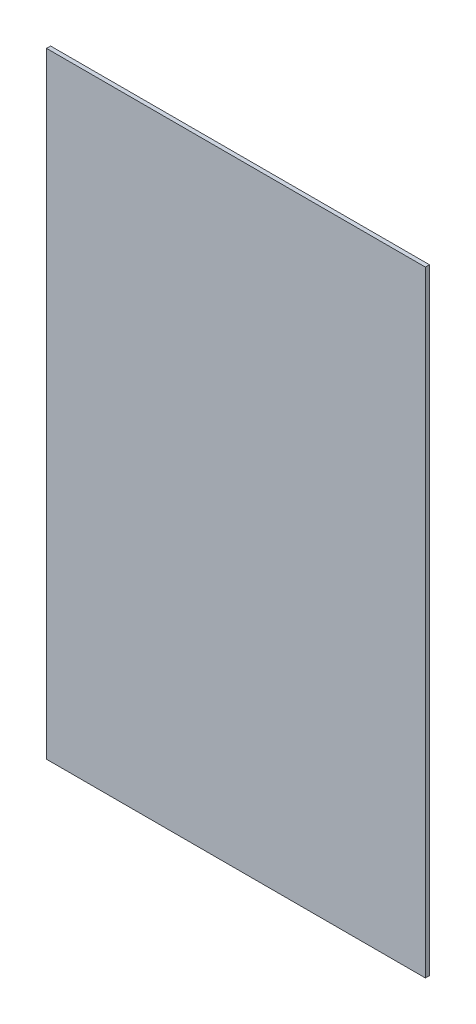
ISO-10303-21;
HEADER;
FILE_DESCRIPTION(('STEP AP214'),'2;1');
FILE_NAME('part.step','',(''),(''),'','','');
FILE_SCHEMA(('AUTOMOTIVE_DESIGN { 1 0 10303 214 1 1 1 1 }'));
ENDSEC;
DATA;
#1=APPLICATION_CONTEXT('core data for automotive mechanical design processes');
#2=APPLICATION_PROTOCOL_DEFINITION('international standard','automotive_design',2000,#1);
#3=PRODUCT_CONTEXT('',#1,'mechanical');
#4=PRODUCT('Part','Part','',(#3));
#5=PRODUCT_RELATED_PRODUCT_CATEGORY('part','',(#4));
#6=PRODUCT_DEFINITION_FORMATION('','',#4);
#7=PRODUCT_DEFINITION_CONTEXT('part definition',#1,'design');
#8=PRODUCT_DEFINITION('design','',#6,#7);
#9=PRODUCT_DEFINITION_SHAPE('','',#8);
#10=(LENGTH_UNIT() NAMED_UNIT(*) SI_UNIT(.MILLI.,.METRE.));
#11=(NAMED_UNIT(*) PLANE_ANGLE_UNIT() SI_UNIT($,.RADIAN.));
#12=(NAMED_UNIT(*) SI_UNIT($,.STERADIAN.) SOLID_ANGLE_UNIT());
#13=UNCERTAINTY_MEASURE_WITH_UNIT(LENGTH_MEASURE(1.E-05),#10,'distance_accuracy_value','');
#14=(GEOMETRIC_REPRESENTATION_CONTEXT(3) GLOBAL_UNCERTAINTY_ASSIGNED_CONTEXT((#13)) GLOBAL_UNIT_ASSIGNED_CONTEXT((#10,
#11,#12)) REPRESENTATION_CONTEXT('',''));
#15=CARTESIAN_POINT('',(0.,0.,0.));
#16=DIRECTION('',(0.,0.,1.));
#17=DIRECTION('',(1.,0.,0.));
#18=AXIS2_PLACEMENT_3D('',#15,#16,#17);
#19=CARTESIAN_POINT('',(-2921.23242971202,-1400.44762764911,19.));
#20=DIRECTION('',(1.,0.,0.));
#21=DIRECTION('',(0.,0.,-1.));
#22=AXIS2_PLACEMENT_3D('',#19,#20,#21);
#23=PLANE('',#22);
#24=DIRECTION('',(0.,-1.,0.));
#25=VECTOR('',#24,1.);
#26=CARTESIAN_POINT('',(-2921.23242971202,-1400.44762764911,0.));
#27=LINE('',#26,#25);
#28=CARTESIAN_POINT('',(-2921.23242971202,1459.55237235089,0.));
#29=VERTEX_POINT('',#28);
#30=CARTESIAN_POINT('',(-2921.23242971202,-1400.44762764911,0.));
#31=VERTEX_POINT('',#30);
#32=EDGE_CURVE('E95',#29,#31,#27,.T.);
#33=ORIENTED_EDGE('',*,*,#32,.T.);
#34=DIRECTION('',(0.,0.,-1.));
#35=VECTOR('',#34,1.);
#36=CARTESIAN_POINT('',(-2921.23242971202,-1400.44762764911,19.));
#37=LINE('',#36,#35);
#38=CARTESIAN_POINT('',(-2921.23242971202,-1400.44762764911,19.));
#39=VERTEX_POINT('',#38);
#40=EDGE_CURVE('E11',#39,#31,#37,.T.);
#41=ORIENTED_EDGE('',*,*,#40,.F.);
#42=DIRECTION('',(0.,-1.,0.));
#43=VECTOR('',#42,1.);
#44=CARTESIAN_POINT('',(-2921.23242971202,-1400.44762764911,19.));
#45=LINE('',#44,#43);
#46=CARTESIAN_POINT('',(-2921.23242971202,1459.55237235089,19.));
#47=VERTEX_POINT('',#46);
#48=EDGE_CURVE('E83',#47,#39,#45,.T.);
#49=ORIENTED_EDGE('',*,*,#48,.F.);
#50=DIRECTION('',(0.,0.,-1.));
#51=VECTOR('',#50,1.);
#52=CARTESIAN_POINT('',(-2921.23242971202,1459.55237235089,19.));
#53=LINE('',#52,#51);
#54=EDGE_CURVE('E91',#47,#29,#53,.T.);
#55=ORIENTED_EDGE('',*,*,#54,.T.);
#56=EDGE_LOOP('',(#33,#41,#49,#55));
#57=FACE_BOUND('',#56,.T.);
#58=ADVANCED_FACE('F32',(#57),#23,.F.);
#59=CARTESIAN_POINT('',(-2921.23242971202,-1400.44762764911,19.));
#60=DIRECTION('',(0.,1.,0.));
#61=DIRECTION('',(0.,0.,1.));
#62=AXIS2_PLACEMENT_3D('',#59,#60,#61);
#63=PLANE('',#62);
#64=DIRECTION('',(1.,0.,0.));
#65=VECTOR('',#64,1.);
#66=CARTESIAN_POINT('',(-2921.23242971202,-1400.44762764911,0.));
#67=LINE('',#66,#65);
#68=CARTESIAN_POINT('',(-1161.23242971208,-1400.44762764911,0.));
#69=VERTEX_POINT('',#68);
#70=EDGE_CURVE('E87',#31,#69,#67,.T.);
#71=ORIENTED_EDGE('',*,*,#70,.T.);
#72=DIRECTION('',(0.,0.,-1.));
#73=VECTOR('',#72,1.);
#74=CARTESIAN_POINT('',(-1161.23242971208,-1400.44762764911,19.));
#75=LINE('',#74,#73);
#76=CARTESIAN_POINT('',(-1161.23242971208,-1400.44762764911,19.));
#77=VERTEX_POINT('',#76);
#78=EDGE_CURVE('E40',#77,#69,#75,.T.);
#79=ORIENTED_EDGE('',*,*,#78,.F.);
#80=DIRECTION('',(1.,0.,0.));
#81=VECTOR('',#80,1.);
#82=CARTESIAN_POINT('',(-2921.23242971202,-1400.44762764911,19.));
#83=LINE('',#82,#81);
#84=EDGE_CURVE('E78',#39,#77,#83,.T.);
#85=ORIENTED_EDGE('',*,*,#84,.F.);
#86=ORIENTED_EDGE('',*,*,#40,.T.);
#87=EDGE_LOOP('',(#71,#79,#85,#86));
#88=FACE_BOUND('',#87,.T.);
#89=ADVANCED_FACE('F86',(#88),#63,.F.);
#90=CARTESIAN_POINT('',(-1161.23242971208,-1400.44762764911,19.));
#91=DIRECTION('',(-1.,0.,0.));
#92=DIRECTION('',(0.,0.,1.));
#93=AXIS2_PLACEMENT_3D('',#90,#91,#92);
#94=PLANE('',#93);
#95=DIRECTION('',(0.,1.,0.));
#96=VECTOR('',#95,1.);
#97=CARTESIAN_POINT('',(-1161.23242971208,-1400.44762764911,0.));
#98=LINE('',#97,#96);
#99=CARTESIAN_POINT('',(-1161.23242971208,1459.55237235089,0.));
#100=VERTEX_POINT('',#99);
#101=EDGE_CURVE('E65',#69,#100,#98,.T.);
#102=ORIENTED_EDGE('',*,*,#101,.T.);
#103=DIRECTION('',(0.,0.,-1.));
#104=VECTOR('',#103,1.);
#105=CARTESIAN_POINT('',(-1161.23242971208,1459.55237235089,19.));
#106=LINE('',#105,#104);
#107=CARTESIAN_POINT('',(-1161.23242971208,1459.55237235089,19.));
#108=VERTEX_POINT('',#107);
#109=EDGE_CURVE('E88',#108,#100,#106,.T.);
#110=ORIENTED_EDGE('',*,*,#109,.F.);
#111=DIRECTION('',(0.,1.,0.));
#112=VECTOR('',#111,1.);
#113=CARTESIAN_POINT('',(-1161.23242971208,-1400.44762764911,19.));
#114=LINE('',#113,#112);
#115=EDGE_CURVE('E81',#77,#108,#114,.T.);
#116=ORIENTED_EDGE('',*,*,#115,.F.);
#117=ORIENTED_EDGE('',*,*,#78,.T.);
#118=EDGE_LOOP('',(#102,#110,#116,#117));
#119=FACE_BOUND('',#118,.T.);
#120=ADVANCED_FACE('F89',(#119),#94,.F.);
#121=CARTESIAN_POINT('',(-2921.23242971202,1459.55237235089,19.));
#122=DIRECTION('',(0.,-1.,0.));
#123=DIRECTION('',(0.,0.,-1.));
#124=AXIS2_PLACEMENT_3D('',#121,#122,#123);
#125=PLANE('',#124);
#126=DIRECTION('',(-1.,0.,0.));
#127=VECTOR('',#126,1.);
#128=CARTESIAN_POINT('',(-2921.23242971202,1459.55237235089,0.));
#129=LINE('',#128,#127);
#130=EDGE_CURVE('E71',#100,#29,#129,.T.);
#131=ORIENTED_EDGE('',*,*,#130,.T.);
#132=ORIENTED_EDGE('',*,*,#54,.F.);
#133=DIRECTION('',(-1.,0.,0.));
#134=VECTOR('',#133,1.);
#135=CARTESIAN_POINT('',(-2921.23242971202,1459.55237235089,19.));
#136=LINE('',#135,#134);
#137=EDGE_CURVE('E48',#108,#47,#136,.T.);
#138=ORIENTED_EDGE('',*,*,#137,.F.);
#139=ORIENTED_EDGE('',*,*,#109,.T.);
#140=EDGE_LOOP('',(#131,#132,#138,#139));
#141=FACE_BOUND('',#140,.T.);
#142=ADVANCED_FACE('F102',(#141),#125,.F.);
#143=CARTESIAN_POINT('',(0.,0.,19.));
#144=DIRECTION('',(0.,0.,-1.));
#145=DIRECTION('',(-1.,0.,0.));
#146=AXIS2_PLACEMENT_3D('',#143,#144,#145);
#147=PLANE('',#146);
#148=ORIENTED_EDGE('',*,*,#48,.T.);
#149=ORIENTED_EDGE('',*,*,#84,.T.);
#150=ORIENTED_EDGE('',*,*,#115,.T.);
#151=ORIENTED_EDGE('',*,*,#137,.T.);
#152=EDGE_LOOP('',(#148,#149,#150,#151));
#153=FACE_BOUND('',#152,.T.);
#154=ADVANCED_FACE('F79',(#153),#147,.F.);
#155=CARTESIAN_POINT('',(0.,0.,0.));
#156=DIRECTION('',(0.,0.,-1.));
#157=DIRECTION('',(-1.,0.,0.));
#158=AXIS2_PLACEMENT_3D('',#155,#156,#157);
#159=PLANE('',#158);
#160=ORIENTED_EDGE('',*,*,#32,.F.);
#161=ORIENTED_EDGE('',*,*,#130,.F.);
#162=ORIENTED_EDGE('',*,*,#101,.F.);
#163=ORIENTED_EDGE('',*,*,#70,.F.);
#164=EDGE_LOOP('',(#160,#161,#162,#163));
#165=FACE_BOUND('',#164,.T.);
#166=ADVANCED_FACE('F105',(#165),#159,.T.);
#167=CLOSED_SHELL('',(#58,#89,#120,#142,#154,#166));
#168=MANIFOLD_SOLID_BREP('B2',#167);
#169=ADVANCED_BREP_SHAPE_REPRESENTATION('',(#18,#168),#14);
#170=SHAPE_DEFINITION_REPRESENTATION(#9,#169);
ENDSEC;
END-ISO-10303-21;
